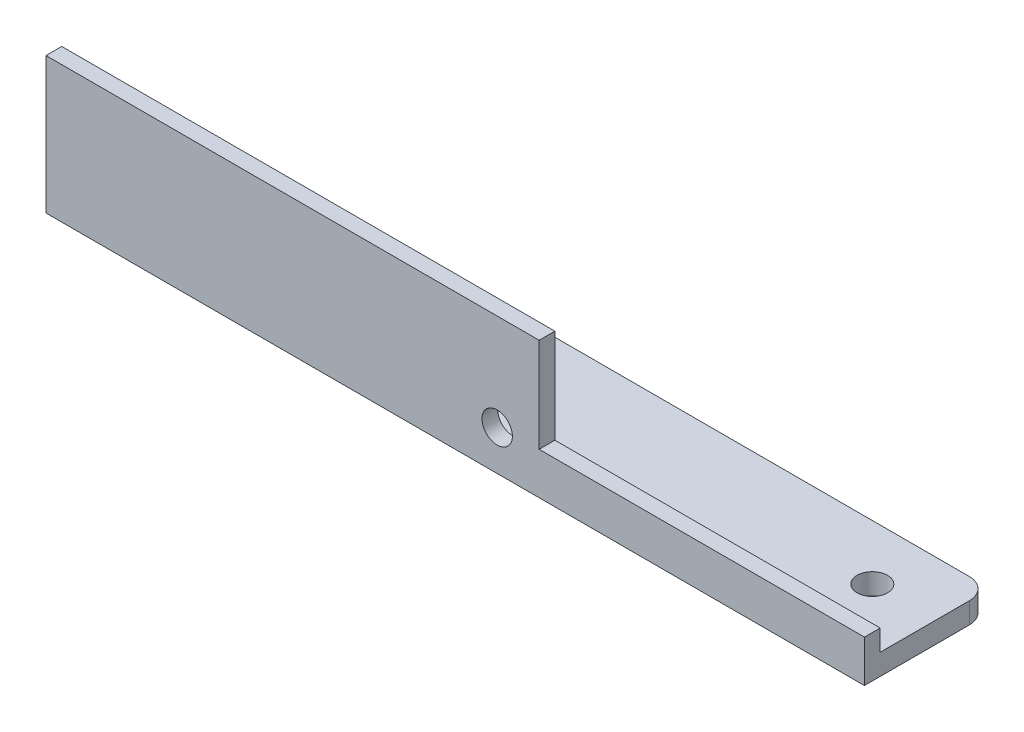
ISO-10303-21;
HEADER;
FILE_DESCRIPTION(('STEP AP214'),'2;1');
FILE_NAME('part.step','',(''),(''),'','','');
FILE_SCHEMA(('AUTOMOTIVE_DESIGN { 1 0 10303 214 1 1 1 1 }'));
ENDSEC;
DATA;
#1=APPLICATION_CONTEXT('core data for automotive mechanical design processes');
#2=APPLICATION_PROTOCOL_DEFINITION('international standard','automotive_design',2000,#1);
#3=PRODUCT_CONTEXT('',#1,'mechanical');
#4=PRODUCT('Part','Part','',(#3));
#5=PRODUCT_RELATED_PRODUCT_CATEGORY('part','',(#4));
#6=PRODUCT_DEFINITION_FORMATION('','',#4);
#7=PRODUCT_DEFINITION_CONTEXT('part definition',#1,'design');
#8=PRODUCT_DEFINITION('design','',#6,#7);
#9=PRODUCT_DEFINITION_SHAPE('','',#8);
#10=(LENGTH_UNIT() NAMED_UNIT(*) SI_UNIT(.MILLI.,.METRE.));
#11=(NAMED_UNIT(*) PLANE_ANGLE_UNIT() SI_UNIT($,.RADIAN.));
#12=(NAMED_UNIT(*) SI_UNIT($,.STERADIAN.) SOLID_ANGLE_UNIT());
#13=UNCERTAINTY_MEASURE_WITH_UNIT(LENGTH_MEASURE(1.E-05),#10,'distance_accuracy_value','');
#14=(GEOMETRIC_REPRESENTATION_CONTEXT(3) GLOBAL_UNCERTAINTY_ASSIGNED_CONTEXT((#13)) GLOBAL_UNIT_ASSIGNED_CONTEXT((#10,
#11,#12)) REPRESENTATION_CONTEXT('',''));
#15=CARTESIAN_POINT('',(0.,0.,0.));
#16=DIRECTION('',(0.,0.,1.));
#17=DIRECTION('',(1.,0.,0.));
#18=AXIS2_PLACEMENT_3D('',#15,#16,#17);
#19=CARTESIAN_POINT('',(39.,-6.5,12.));
#20=DIRECTION('',(-1.,0.,0.));
#21=DIRECTION('',(0.,0.,1.));
#22=AXIS2_PLACEMENT_3D('',#19,#20,#21);
#23=PLANE('',#22);
#24=DIRECTION('',(0.,0.,-1.));
#25=VECTOR('',#24,1.);
#26=CARTESIAN_POINT('',(39.,-6.5,12.));
#27=LINE('',#26,#25);
#28=CARTESIAN_POINT('',(39.,-6.5,12.));
#29=VERTEX_POINT('',#28);
#30=CARTESIAN_POINT('',(39.,-6.5,2.));
#31=VERTEX_POINT('',#30);
#32=EDGE_CURVE('E141',#29,#31,#27,.T.);
#33=ORIENTED_EDGE('',*,*,#32,.T.);
#34=DIRECTION('',(0.,1.,0.));
#35=VECTOR('',#34,1.);
#36=CARTESIAN_POINT('',(39.,-4.5,2.));
#37=LINE('',#36,#35);
#38=CARTESIAN_POINT('',(39.,-4.5,2.));
#39=VERTEX_POINT('',#38);
#40=EDGE_CURVE('E150',#31,#39,#37,.T.);
#41=ORIENTED_EDGE('',*,*,#40,.T.);
#42=DIRECTION('',(0.,0.,-1.));
#43=VECTOR('',#42,1.);
#44=CARTESIAN_POINT('',(39.,-4.5,10.5));
#45=LINE('',#44,#43);
#46=CARTESIAN_POINT('',(39.,-4.5,10.5));
#47=VERTEX_POINT('',#46);
#48=EDGE_CURVE('E154',#47,#39,#45,.T.);
#49=ORIENTED_EDGE('',*,*,#48,.F.);
#50=DIRECTION('',(0.,1.,0.));
#51=VECTOR('',#50,1.);
#52=CARTESIAN_POINT('',(39.,-4.5,10.5));
#53=LINE('',#52,#51);
#54=CARTESIAN_POINT('',(39.,-2.5,10.5));
#55=VERTEX_POINT('',#54);
#56=EDGE_CURVE('E122',#47,#55,#53,.T.);
#57=ORIENTED_EDGE('',*,*,#56,.T.);
#58=DIRECTION('',(0.,0.,-1.));
#59=VECTOR('',#58,1.);
#60=CARTESIAN_POINT('',(39.,-2.5,12.));
#61=LINE('',#60,#59);
#62=CARTESIAN_POINT('',(39.,-2.5,12.));
#63=VERTEX_POINT('',#62);
#64=EDGE_CURVE('E106',#63,#55,#61,.T.);
#65=ORIENTED_EDGE('',*,*,#64,.F.);
#66=DIRECTION('',(0.,1.,0.));
#67=VECTOR('',#66,1.);
#68=CARTESIAN_POINT('',(39.,-6.5,12.));
#69=LINE('',#68,#67);
#70=EDGE_CURVE('E120',#29,#63,#69,.T.);
#71=ORIENTED_EDGE('',*,*,#70,.F.);
#72=EDGE_LOOP('',(#33,#41,#49,#57,#65,#71));
#73=FACE_BOUND('',#72,.T.);
#74=ADVANCED_FACE('F33',(#73),#23,.F.);
#75=CARTESIAN_POINT('',(-39.,6.5,12.));
#76=DIRECTION('',(0.,-1.,0.));
#77=DIRECTION('',(0.,0.,-1.));
#78=AXIS2_PLACEMENT_3D('',#75,#76,#77);
#79=PLANE('',#78);
#80=DIRECTION('',(-1.,0.,0.));
#81=VECTOR('',#80,1.);
#82=CARTESIAN_POINT('',(-39.,6.5,12.));
#83=LINE('',#82,#81);
#84=CARTESIAN_POINT('',(7.99999999999998,6.5,12.));
#85=VERTEX_POINT('',#84);
#86=CARTESIAN_POINT('',(-39.,6.5,12.));
#87=VERTEX_POINT('',#86);
#88=EDGE_CURVE('E128',#85,#87,#83,.T.);
#89=ORIENTED_EDGE('',*,*,#88,.F.);
#90=DIRECTION('',(0.,0.,-1.));
#91=VECTOR('',#90,1.);
#92=CARTESIAN_POINT('',(7.99999999999998,6.5,12.));
#93=LINE('',#92,#91);
#94=CARTESIAN_POINT('',(7.99999999999998,6.5,10.5));
#95=VERTEX_POINT('',#94);
#96=EDGE_CURVE('E184',#85,#95,#93,.T.);
#97=ORIENTED_EDGE('',*,*,#96,.T.);
#98=DIRECTION('',(1.,0.,0.));
#99=VECTOR('',#98,1.);
#100=CARTESIAN_POINT('',(-39.,6.5,10.5));
#101=LINE('',#100,#99);
#102=CARTESIAN_POINT('',(-39.,6.5,10.5));
#103=VERTEX_POINT('',#102);
#104=EDGE_CURVE('E168',#103,#95,#101,.T.);
#105=ORIENTED_EDGE('',*,*,#104,.F.);
#106=DIRECTION('',(0.,0.,-1.));
#107=VECTOR('',#106,1.);
#108=CARTESIAN_POINT('',(-39.,6.5,12.));
#109=LINE('',#108,#107);
#110=EDGE_CURVE('E147',#87,#103,#109,.T.);
#111=ORIENTED_EDGE('',*,*,#110,.F.);
#112=EDGE_LOOP('',(#89,#97,#105,#111));
#113=FACE_BOUND('',#112,.T.);
#114=ADVANCED_FACE('F182',(#113),#79,.F.);
#115=CARTESIAN_POINT('',(-39.,-6.5,12.));
#116=DIRECTION('',(1.,0.,0.));
#117=DIRECTION('',(0.,0.,-1.));
#118=AXIS2_PLACEMENT_3D('',#115,#116,#117);
#119=PLANE('',#118);
#120=ORIENTED_EDGE('',*,*,#110,.T.);
#121=DIRECTION('',(0.,1.,0.));
#122=VECTOR('',#121,1.);
#123=CARTESIAN_POINT('',(-39.,-4.5,10.5));
#124=LINE('',#123,#122);
#125=CARTESIAN_POINT('',(-39.,-4.5,10.5));
#126=VERTEX_POINT('',#125);
#127=EDGE_CURVE('E136',#126,#103,#124,.T.);
#128=ORIENTED_EDGE('',*,*,#127,.F.);
#129=DIRECTION('',(0.,0.,1.));
#130=VECTOR('',#129,1.);
#131=CARTESIAN_POINT('',(-39.,-4.5,10.5));
#132=LINE('',#131,#130);
#133=CARTESIAN_POINT('',(-39.,-4.5,0.));
#134=VERTEX_POINT('',#133);
#135=EDGE_CURVE('E164',#134,#126,#132,.T.);
#136=ORIENTED_EDGE('',*,*,#135,.F.);
#137=DIRECTION('',(0.,-1.,0.));
#138=VECTOR('',#137,1.);
#139=CARTESIAN_POINT('',(-39.,-6.5,0.));
#140=LINE('',#139,#138);
#141=CARTESIAN_POINT('',(-39.,-6.5,0.));
#142=VERTEX_POINT('',#141);
#143=EDGE_CURVE('E133',#134,#142,#140,.T.);
#144=ORIENTED_EDGE('',*,*,#143,.T.);
#145=DIRECTION('',(0.,0.,-1.));
#146=VECTOR('',#145,1.);
#147=CARTESIAN_POINT('',(-39.,-6.5,12.));
#148=LINE('',#147,#146);
#149=CARTESIAN_POINT('',(-39.,-6.5,12.));
#150=VERTEX_POINT('',#149);
#151=EDGE_CURVE('E144',#150,#142,#148,.T.);
#152=ORIENTED_EDGE('',*,*,#151,.F.);
#153=DIRECTION('',(0.,-1.,0.));
#154=VECTOR('',#153,1.);
#155=CARTESIAN_POINT('',(-39.,-6.5,12.));
#156=LINE('',#155,#154);
#157=EDGE_CURVE('E131',#87,#150,#156,.T.);
#158=ORIENTED_EDGE('',*,*,#157,.F.);
#159=EDGE_LOOP('',(#120,#128,#136,#144,#152,#158));
#160=FACE_BOUND('',#159,.T.);
#161=ADVANCED_FACE('F185',(#160),#119,.F.);
#162=CARTESIAN_POINT('',(-39.,-6.5,12.));
#163=DIRECTION('',(0.,1.,0.));
#164=DIRECTION('',(0.,0.,1.));
#165=AXIS2_PLACEMENT_3D('',#162,#163,#164);
#166=PLANE('',#165);
#167=CARTESIAN_POINT('',(33.,-6.5,5.25));
#168=DIRECTION('',(0.,1.,0.));
#169=DIRECTION('',(0.,0.,1.));
#170=AXIS2_PLACEMENT_3D('',#167,#168,#169);
#171=CIRCLE('',#170,1.45);
#172=CARTESIAN_POINT('',(33.,-6.5,6.7));
#173=VERTEX_POINT('',#172);
#174=EDGE_CURVE('E200',#173,#173,#171,.T.);
#175=ORIENTED_EDGE('',*,*,#174,.T.);
#176=EDGE_LOOP('',(#175));
#177=FACE_BOUND('',#176,.T.);
#178=CARTESIAN_POINT('',(-35.,-6.5,5.25));
#179=DIRECTION('',(0.,1.,0.));
#180=DIRECTION('',(0.,0.,1.));
#181=AXIS2_PLACEMENT_3D('',#178,#179,#180);
#182=CIRCLE('',#181,1.45);
#183=CARTESIAN_POINT('',(-35.,-6.5,6.7));
#184=VERTEX_POINT('',#183);
#185=EDGE_CURVE('E170',#184,#184,#182,.T.);
#186=ORIENTED_EDGE('',*,*,#185,.T.);
#187=EDGE_LOOP('',(#186));
#188=FACE_BOUND('',#187,.T.);
#189=DIRECTION('',(1.,0.,0.));
#190=VECTOR('',#189,1.);
#191=CARTESIAN_POINT('',(-39.,-6.5,0.));
#192=LINE('',#191,#190);
#193=CARTESIAN_POINT('',(37.,-6.5,0.));
#194=VERTEX_POINT('',#193);
#195=EDGE_CURVE('E129',#142,#194,#192,.T.);
#196=ORIENTED_EDGE('',*,*,#195,.T.);
#197=CARTESIAN_POINT('',(37.,-6.5,2.));
#198=DIRECTION('',(0.,1.,0.));
#199=DIRECTION('',(0.,0.,1.));
#200=AXIS2_PLACEMENT_3D('',#197,#198,#199);
#201=CIRCLE('',#200,2.);
#202=EDGE_CURVE('E11',#194,#31,#201,.F.);
#203=ORIENTED_EDGE('',*,*,#202,.T.);
#204=ORIENTED_EDGE('',*,*,#32,.F.);
#205=DIRECTION('',(1.,0.,0.));
#206=VECTOR('',#205,1.);
#207=CARTESIAN_POINT('',(-39.,-6.5,12.));
#208=LINE('',#207,#206);
#209=EDGE_CURVE('E126',#150,#29,#208,.T.);
#210=ORIENTED_EDGE('',*,*,#209,.F.);
#211=ORIENTED_EDGE('',*,*,#151,.T.);
#212=EDGE_LOOP('',(#196,#203,#204,#210,#211));
#213=FACE_BOUND('',#212,.T.);
#214=ADVANCED_FACE('F210',(#177,#188,#213),#166,.F.);
#215=CARTESIAN_POINT('',(0.,0.,12.));
#216=DIRECTION('',(0.,0.,-1.));
#217=DIRECTION('',(-1.,0.,0.));
#218=AXIS2_PLACEMENT_3D('',#215,#216,#217);
#219=PLANE('',#218);
#220=CARTESIAN_POINT('',(3.99999999999998,-2.7,12.));
#221=DIRECTION('',(0.,0.,1.));
#222=DIRECTION('',(1.,0.,0.));
#223=AXIS2_PLACEMENT_3D('',#220,#221,#222);
#224=CIRCLE('',#223,1.44999999999999);
#225=CARTESIAN_POINT('',(5.44999999999997,-2.7,12.));
#226=VERTEX_POINT('',#225);
#227=EDGE_CURVE('E343',#226,#226,#224,.T.);
#228=ORIENTED_EDGE('',*,*,#227,.F.);
#229=EDGE_LOOP('',(#228));
#230=FACE_BOUND('',#229,.T.);
#231=DIRECTION('',(-1.,0.,0.));
#232=VECTOR('',#231,1.);
#233=CARTESIAN_POINT('',(39.,-2.5,12.));
#234=LINE('',#233,#232);
#235=CARTESIAN_POINT('',(7.99999999999998,-2.5,12.));
#236=VERTEX_POINT('',#235);
#237=EDGE_CURVE('E102',#63,#236,#234,.T.);
#238=ORIENTED_EDGE('',*,*,#237,.T.);
#239=DIRECTION('',(0.,1.,0.));
#240=VECTOR('',#239,1.);
#241=CARTESIAN_POINT('',(7.99999999999998,6.5,12.));
#242=LINE('',#241,#240);
#243=EDGE_CURVE('E113',#236,#85,#242,.T.);
#244=ORIENTED_EDGE('',*,*,#243,.T.);
#245=ORIENTED_EDGE('',*,*,#88,.T.);
#246=ORIENTED_EDGE('',*,*,#157,.T.);
#247=ORIENTED_EDGE('',*,*,#209,.T.);
#248=ORIENTED_EDGE('',*,*,#70,.T.);
#249=EDGE_LOOP('',(#238,#244,#245,#246,#247,#248));
#250=FACE_BOUND('',#249,.T.);
#251=ADVANCED_FACE('F124',(#230,#250),#219,.F.);
#252=CARTESIAN_POINT('',(0.,0.,0.));
#253=DIRECTION('',(0.,0.,-1.));
#254=DIRECTION('',(-1.,0.,0.));
#255=AXIS2_PLACEMENT_3D('',#252,#253,#254);
#256=PLANE('',#255);
#257=DIRECTION('',(-1.,0.,0.));
#258=VECTOR('',#257,1.);
#259=CARTESIAN_POINT('',(-39.,-4.5,0.));
#260=LINE('',#259,#258);
#261=CARTESIAN_POINT('',(37.,-4.5,0.));
#262=VERTEX_POINT('',#261);
#263=EDGE_CURVE('E161',#262,#134,#260,.T.);
#264=ORIENTED_EDGE('',*,*,#263,.F.);
#265=DIRECTION('',(0.,1.,0.));
#266=VECTOR('',#265,1.);
#267=CARTESIAN_POINT('',(37.,-6.5,0.));
#268=LINE('',#267,#266);
#269=EDGE_CURVE('E41',#262,#194,#268,.F.);
#270=ORIENTED_EDGE('',*,*,#269,.T.);
#271=ORIENTED_EDGE('',*,*,#195,.F.);
#272=ORIENTED_EDGE('',*,*,#143,.F.);
#273=EDGE_LOOP('',(#264,#270,#271,#272));
#274=FACE_BOUND('',#273,.T.);
#275=ADVANCED_FACE('F208',(#274),#256,.T.);
#276=CARTESIAN_POINT('',(-39.,-4.5,10.5));
#277=DIRECTION('',(0.,0.,1.));
#278=DIRECTION('',(1.,0.,0.));
#279=AXIS2_PLACEMENT_3D('',#276,#277,#278);
#280=PLANE('',#279);
#281=CARTESIAN_POINT('',(3.99999999999998,-2.7,10.5));
#282=DIRECTION('',(0.,0.,1.));
#283=DIRECTION('',(1.,0.,0.));
#284=AXIS2_PLACEMENT_3D('',#281,#282,#283);
#285=CIRCLE('',#284,1.44999999999999);
#286=CARTESIAN_POINT('',(5.44999999999996,-2.7,10.5));
#287=VERTEX_POINT('',#286);
#288=EDGE_CURVE('E193',#287,#287,#285,.T.);
#289=ORIENTED_EDGE('',*,*,#288,.T.);
#290=EDGE_LOOP('',(#289));
#291=FACE_BOUND('',#290,.T.);
#292=ORIENTED_EDGE('',*,*,#104,.T.);
#293=DIRECTION('',(0.,1.,0.));
#294=VECTOR('',#293,1.);
#295=CARTESIAN_POINT('',(7.99999999999998,6.5,10.5));
#296=LINE('',#295,#294);
#297=CARTESIAN_POINT('',(7.99999999999998,-2.5,10.5));
#298=VERTEX_POINT('',#297);
#299=EDGE_CURVE('E114',#298,#95,#296,.T.);
#300=ORIENTED_EDGE('',*,*,#299,.F.);
#301=DIRECTION('',(-1.,0.,0.));
#302=VECTOR('',#301,1.);
#303=CARTESIAN_POINT('',(39.,-2.5,10.5));
#304=LINE('',#303,#302);
#305=EDGE_CURVE('E191',#55,#298,#304,.T.);
#306=ORIENTED_EDGE('',*,*,#305,.F.);
#307=ORIENTED_EDGE('',*,*,#56,.F.);
#308=DIRECTION('',(1.,0.,0.));
#309=VECTOR('',#308,1.);
#310=CARTESIAN_POINT('',(-39.,-4.5,10.5));
#311=LINE('',#310,#309);
#312=EDGE_CURVE('E160',#126,#47,#311,.T.);
#313=ORIENTED_EDGE('',*,*,#312,.F.);
#314=ORIENTED_EDGE('',*,*,#127,.T.);
#315=EDGE_LOOP('',(#292,#300,#306,#307,#313,#314));
#316=FACE_BOUND('',#315,.T.);
#317=ADVANCED_FACE('F174',(#291,#316),#280,.F.);
#318=CARTESIAN_POINT('',(0.,-4.5,0.));
#319=DIRECTION('',(0.,-1.,0.));
#320=DIRECTION('',(0.,0.,-1.));
#321=AXIS2_PLACEMENT_3D('',#318,#319,#320);
#322=PLANE('',#321);
#323=CARTESIAN_POINT('',(33.,-4.5,5.25));
#324=DIRECTION('',(0.,1.,0.));
#325=DIRECTION('',(0.,0.,1.));
#326=AXIS2_PLACEMENT_3D('',#323,#324,#325);
#327=CIRCLE('',#326,1.44999999999999);
#328=CARTESIAN_POINT('',(33.,-4.5,6.69999999999999));
#329=VERTEX_POINT('',#328);
#330=EDGE_CURVE('E196',#329,#329,#327,.T.);
#331=ORIENTED_EDGE('',*,*,#330,.F.);
#332=EDGE_LOOP('',(#331));
#333=FACE_BOUND('',#332,.T.);
#334=CARTESIAN_POINT('',(-35.,-4.5,5.25));
#335=DIRECTION('',(0.,1.,0.));
#336=DIRECTION('',(0.,0.,1.));
#337=AXIS2_PLACEMENT_3D('',#334,#335,#336);
#338=CIRCLE('',#337,1.44999999999999);
#339=CARTESIAN_POINT('',(-35.,-4.5,6.69999999999999));
#340=VERTEX_POINT('',#339);
#341=EDGE_CURVE('E203',#340,#340,#338,.T.);
#342=ORIENTED_EDGE('',*,*,#341,.F.);
#343=EDGE_LOOP('',(#342));
#344=FACE_BOUND('',#343,.T.);
#345=ORIENTED_EDGE('',*,*,#48,.T.);
#346=CARTESIAN_POINT('',(37.,-4.5,2.));
#347=DIRECTION('',(0.,-1.,0.));
#348=DIRECTION('',(0.,0.,-1.));
#349=AXIS2_PLACEMENT_3D('',#346,#347,#348);
#350=CIRCLE('',#349,2.);
#351=EDGE_CURVE('E55',#39,#262,#350,.F.);
#352=ORIENTED_EDGE('',*,*,#351,.T.);
#353=ORIENTED_EDGE('',*,*,#263,.T.);
#354=ORIENTED_EDGE('',*,*,#135,.T.);
#355=ORIENTED_EDGE('',*,*,#312,.T.);
#356=EDGE_LOOP('',(#345,#352,#353,#354,#355));
#357=FACE_BOUND('',#356,.T.);
#358=ADVANCED_FACE('F158',(#333,#344,#357),#322,.F.);
#359=CARTESIAN_POINT('',(-35.,-4.5,5.25));
#360=DIRECTION('',(0.,1.,0.));
#361=DIRECTION('',(0.,0.,1.));
#362=AXIS2_PLACEMENT_3D('',#359,#360,#361);
#363=CYLINDRICAL_SURFACE('',#362,1.44999999999999);
#364=ORIENTED_EDGE('',*,*,#185,.F.);
#365=EDGE_LOOP('',(#364));
#366=FACE_BOUND('',#365,.T.);
#367=ORIENTED_EDGE('',*,*,#341,.T.);
#368=EDGE_LOOP('',(#367));
#369=FACE_BOUND('',#368,.T.);
#370=ADVANCED_FACE('F239',(#366,#369),#363,.F.);
#371=CARTESIAN_POINT('',(33.,-4.5,5.25));
#372=DIRECTION('',(0.,1.,0.));
#373=DIRECTION('',(0.,0.,1.));
#374=AXIS2_PLACEMENT_3D('',#371,#372,#373);
#375=CYLINDRICAL_SURFACE('',#374,1.44999999999999);
#376=ORIENTED_EDGE('',*,*,#174,.F.);
#377=EDGE_LOOP('',(#376));
#378=FACE_BOUND('',#377,.T.);
#379=ORIENTED_EDGE('',*,*,#330,.T.);
#380=EDGE_LOOP('',(#379));
#381=FACE_BOUND('',#380,.T.);
#382=ADVANCED_FACE('F243',(#378,#381),#375,.F.);
#383=CARTESIAN_POINT('',(7.99999999999998,6.5,12.));
#384=DIRECTION('',(-1.,0.,0.));
#385=DIRECTION('',(0.,-1.,0.));
#386=AXIS2_PLACEMENT_3D('',#383,#384,#385);
#387=PLANE('',#386);
#388=ORIENTED_EDGE('',*,*,#299,.T.);
#389=ORIENTED_EDGE('',*,*,#96,.F.);
#390=ORIENTED_EDGE('',*,*,#243,.F.);
#391=DIRECTION('',(0.,0.,-1.));
#392=VECTOR('',#391,1.);
#393=CARTESIAN_POINT('',(7.99999999999998,-2.5,12.));
#394=LINE('',#393,#392);
#395=EDGE_CURVE('E108',#236,#298,#394,.T.);
#396=ORIENTED_EDGE('',*,*,#395,.T.);
#397=EDGE_LOOP('',(#388,#389,#390,#396));
#398=FACE_BOUND('',#397,.T.);
#399=ADVANCED_FACE('F247',(#398),#387,.F.);
#400=CARTESIAN_POINT('',(39.,-2.5,12.));
#401=DIRECTION('',(0.,-1.,0.));
#402=DIRECTION('',(0.,0.,-1.));
#403=AXIS2_PLACEMENT_3D('',#400,#401,#402);
#404=PLANE('',#403);
#405=ORIENTED_EDGE('',*,*,#305,.T.);
#406=ORIENTED_EDGE('',*,*,#395,.F.);
#407=ORIENTED_EDGE('',*,*,#237,.F.);
#408=ORIENTED_EDGE('',*,*,#64,.T.);
#409=EDGE_LOOP('',(#405,#406,#407,#408));
#410=FACE_BOUND('',#409,.T.);
#411=ADVANCED_FACE('F105',(#410),#404,.F.);
#412=CARTESIAN_POINT('',(3.99999999999998,-2.7,12.));
#413=DIRECTION('',(0.,0.,1.));
#414=DIRECTION('',(1.,0.,0.));
#415=AXIS2_PLACEMENT_3D('',#412,#413,#414);
#416=CYLINDRICAL_SURFACE('',#415,1.44999999999999);
#417=ORIENTED_EDGE('',*,*,#227,.T.);
#418=EDGE_LOOP('',(#417));
#419=FACE_BOUND('',#418,.T.);
#420=ORIENTED_EDGE('',*,*,#288,.F.);
#421=EDGE_LOOP('',(#420));
#422=FACE_BOUND('',#421,.T.);
#423=ADVANCED_FACE('F212',(#419,#422),#416,.F.);
#424=CARTESIAN_POINT('',(37.,-6.5,2.));
#425=DIRECTION('',(0.,-1.,0.));
#426=DIRECTION('',(0.,0.,-1.));
#427=AXIS2_PLACEMENT_3D('',#424,#425,#426);
#428=CYLINDRICAL_SURFACE('',#427,2.);
#429=ORIENTED_EDGE('',*,*,#202,.F.);
#430=ORIENTED_EDGE('',*,*,#269,.F.);
#431=ORIENTED_EDGE('',*,*,#351,.F.);
#432=ORIENTED_EDGE('',*,*,#40,.F.);
#433=EDGE_LOOP('',(#429,#430,#431,#432));
#434=FACE_BOUND('',#433,.T.);
#435=ADVANCED_FACE('F35',(#434),#428,.T.);
#436=CLOSED_SHELL('',(#74,#114,#161,#214,#251,#275,#317,#358,#370,#382,#399,#411,#423,#435));
#437=MANIFOLD_SOLID_BREP('B2',#436);
#438=ADVANCED_BREP_SHAPE_REPRESENTATION('',(#18,#437),#14);
#439=SHAPE_DEFINITION_REPRESENTATION(#9,#438);
ENDSEC;
END-ISO-10303-21;
